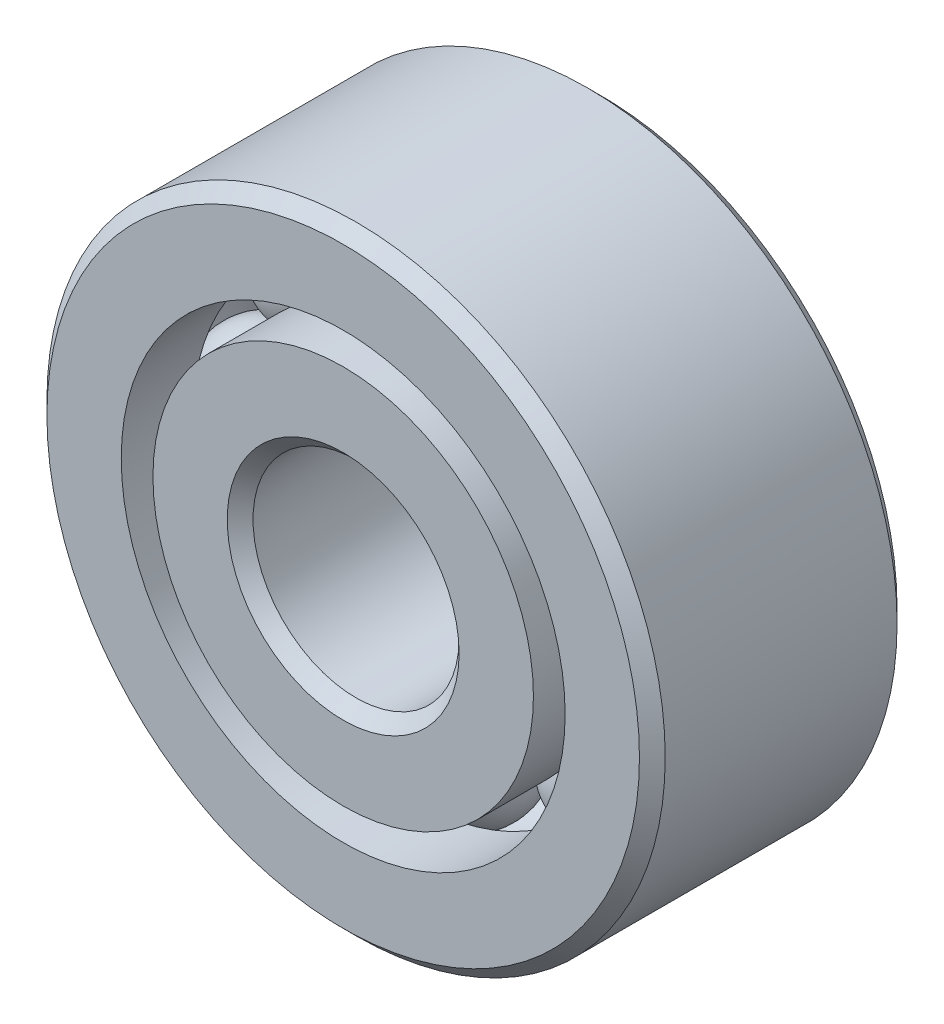
ISO-10303-21;
HEADER;
FILE_DESCRIPTION(('STEP AP214'),'2;1');
FILE_NAME('part.step','',(''),(''),'','','');
FILE_SCHEMA(('AUTOMOTIVE_DESIGN { 1 0 10303 214 1 1 1 1 }'));
ENDSEC;
DATA;
#1=APPLICATION_CONTEXT('core data for automotive mechanical design processes');
#2=APPLICATION_PROTOCOL_DEFINITION('international standard','automotive_design',2000,#1);
#3=PRODUCT_CONTEXT('',#1,'mechanical');
#4=PRODUCT('Part','Part','',(#3));
#5=PRODUCT_RELATED_PRODUCT_CATEGORY('part','',(#4));
#6=PRODUCT_DEFINITION_FORMATION('','',#4);
#7=PRODUCT_DEFINITION_CONTEXT('part definition',#1,'design');
#8=PRODUCT_DEFINITION('design','',#6,#7);
#9=PRODUCT_DEFINITION_SHAPE('','',#8);
#10=(LENGTH_UNIT() NAMED_UNIT(*) SI_UNIT(.MILLI.,.METRE.));
#11=(NAMED_UNIT(*) PLANE_ANGLE_UNIT() SI_UNIT($,.RADIAN.));
#12=(NAMED_UNIT(*) SI_UNIT($,.STERADIAN.) SOLID_ANGLE_UNIT());
#13=UNCERTAINTY_MEASURE_WITH_UNIT(LENGTH_MEASURE(1.E-05),#10,'distance_accuracy_value','');
#14=(GEOMETRIC_REPRESENTATION_CONTEXT(3) GLOBAL_UNCERTAINTY_ASSIGNED_CONTEXT((#13)) GLOBAL_UNIT_ASSIGNED_CONTEXT((#10,
#11,#12)) REPRESENTATION_CONTEXT('',''));
#15=CARTESIAN_POINT('',(0.,0.,0.));
#16=DIRECTION('',(0.,0.,1.));
#17=DIRECTION('',(1.,0.,0.));
#18=AXIS2_PLACEMENT_3D('',#15,#16,#17);
#19=CARTESIAN_POINT('',(-2.24506403026726,2.24506403026731,0.));
#20=DIRECTION('',(0.,0.,1.));
#21=DIRECTION('',(-0.707106781186539,0.707106781186556,0.));
#22=AXIS2_PLACEMENT_3D('',#19,#20,#21);
#23=SPHERICAL_SURFACE('',#22,0.915136422466877);
#24=CARTESIAN_POINT('',(-2.24506403026726,2.24506403026731,0.915136422466874));
#25=VERTEX_POINT('',#24);
#26=VERTEX_LOOP('',#25);
#27=FACE_BOUND('',#26,.T.);
#28=ADVANCED_FACE('F40',(#27),#23,.T.);
#29=CLOSED_SHELL('',(#28));
#30=MANIFOLD_SOLID_BREP('B2',#29);
#31=CARTESIAN_POINT('',(-3.175,0.,0.));
#32=DIRECTION('',(0.,0.,1.));
#33=DIRECTION('',(-1.,0.,0.));
#34=AXIS2_PLACEMENT_3D('',#31,#32,#33);
#35=SPHERICAL_SURFACE('',#34,0.915136422466877);
#36=CARTESIAN_POINT('',(-3.175,0.,0.915136422466874));
#37=VERTEX_POINT('',#36);
#38=VERTEX_LOOP('',#37);
#39=FACE_BOUND('',#38,.T.);
#40=ADVANCED_FACE('F61',(#39),#35,.T.);
#41=CLOSED_SHELL('',(#40));
#42=MANIFOLD_SOLID_BREP('B6',#41);
#43=CARTESIAN_POINT('',(-2.24506403026731,-2.24506403026727,0.));
#44=DIRECTION('',(0.,0.,1.));
#45=DIRECTION('',(-0.707106781186554,-0.707106781186541,0.));
#46=AXIS2_PLACEMENT_3D('',#43,#44,#45);
#47=SPHERICAL_SURFACE('',#46,0.915136422466877);
#48=CARTESIAN_POINT('',(-2.24506403026731,-2.24506403026727,0.915136422466874));
#49=VERTEX_POINT('',#48);
#50=VERTEX_LOOP('',#49);
#51=FACE_BOUND('',#50,.T.);
#52=ADVANCED_FACE('F82',(#51),#47,.T.);
#53=CLOSED_SHELL('',(#52));
#54=MANIFOLD_SOLID_BREP('B36',#53);
#55=CARTESIAN_POINT('',(0.,-3.175,0.));
#56=DIRECTION('',(0.,0.,1.));
#57=DIRECTION('',(0.,-1.,0.));
#58=AXIS2_PLACEMENT_3D('',#55,#56,#57);
#59=SPHERICAL_SURFACE('',#58,0.915136422466877);
#60=CARTESIAN_POINT('',(0.,-3.175,0.915136422466874));
#61=VERTEX_POINT('',#60);
#62=VERTEX_LOOP('',#61);
#63=FACE_BOUND('',#62,.T.);
#64=ADVANCED_FACE('F103',(#63),#59,.T.);
#65=CLOSED_SHELL('',(#64));
#66=MANIFOLD_SOLID_BREP('B57',#65);
#67=CARTESIAN_POINT('',(2.24506403026727,-2.2450640302673,0.));
#68=DIRECTION('',(0.,0.,1.));
#69=DIRECTION('',(0.707106781186544,-0.707106781186551,0.));
#70=AXIS2_PLACEMENT_3D('',#67,#68,#69);
#71=SPHERICAL_SURFACE('',#70,0.915136422466877);
#72=CARTESIAN_POINT('',(2.24506403026727,-2.2450640302673,0.915136422466874));
#73=VERTEX_POINT('',#72);
#74=VERTEX_LOOP('',#73);
#75=FACE_BOUND('',#74,.T.);
#76=ADVANCED_FACE('F124',(#75),#71,.T.);
#77=CLOSED_SHELL('',(#76));
#78=MANIFOLD_SOLID_BREP('B78',#77);
#79=CARTESIAN_POINT('',(3.175,0.,0.));
#80=DIRECTION('',(0.,0.,1.));
#81=DIRECTION('',(1.,0.,0.));
#82=AXIS2_PLACEMENT_3D('',#79,#80,#81);
#83=SPHERICAL_SURFACE('',#82,0.915136422466877);
#84=CARTESIAN_POINT('',(3.175,0.,0.915136422466874));
#85=VERTEX_POINT('',#84);
#86=VERTEX_LOOP('',#85);
#87=FACE_BOUND('',#86,.T.);
#88=ADVANCED_FACE('F145',(#87),#83,.T.);
#89=CLOSED_SHELL('',(#88));
#90=MANIFOLD_SOLID_BREP('B99',#89);
#91=CARTESIAN_POINT('',(2.24506403026729,2.24506403026728,0.));
#92=DIRECTION('',(0.,0.,1.));
#93=DIRECTION('',(0.707106781186549,0.707106781186546,0.));
#94=AXIS2_PLACEMENT_3D('',#91,#92,#93);
#95=SPHERICAL_SURFACE('',#94,0.915136422466877);
#96=CARTESIAN_POINT('',(2.24506403026729,2.24506403026728,0.915136422466874));
#97=VERTEX_POINT('',#96);
#98=VERTEX_LOOP('',#97);
#99=FACE_BOUND('',#98,.T.);
#100=ADVANCED_FACE('F166',(#99),#95,.T.);
#101=CLOSED_SHELL('',(#100));
#102=MANIFOLD_SOLID_BREP('B120',#101);
#103=CARTESIAN_POINT('',(0.,3.175,0.));
#104=DIRECTION('',(0.,0.,1.));
#105=DIRECTION('',(0.,1.,0.));
#106=AXIS2_PLACEMENT_3D('',#103,#104,#105);
#107=SPHERICAL_SURFACE('',#106,0.915136422466877);
#108=CARTESIAN_POINT('',(0.,3.175,0.915136422466874));
#109=VERTEX_POINT('',#108);
#110=VERTEX_LOOP('',#109);
#111=FACE_BOUND('',#110,.T.);
#112=ADVANCED_FACE('F189',(#111),#107,.T.);
#113=CLOSED_SHELL('',(#112));
#114=MANIFOLD_SOLID_BREP('B141',#113);
#115=CARTESIAN_POINT('',(0.,2.93076923076923,1.984375));
#116=DIRECTION('',(0.,0.,-1.));
#117=DIRECTION('',(-1.,0.,0.));
#118=AXIS2_PLACEMENT_3D('',#115,#116,#117);
#119=PLANE('',#118);
#120=CARTESIAN_POINT('',(0.,0.,1.984375));
#121=DIRECTION('',(0.,0.,1.));
#122=DIRECTION('',(1.,0.,0.));
#123=AXIS2_PLACEMENT_3D('',#120,#121,#122);
#124=CIRCLE('',#123,1.7859375);
#125=CARTESIAN_POINT('',(1.7859375,0.,1.984375));
#126=VERTEX_POINT('',#125);
#127=EDGE_CURVE('E237',#126,#126,#124,.T.);
#128=ORIENTED_EDGE('',*,*,#127,.F.);
#129=EDGE_LOOP('',(#128));
#130=FACE_BOUND('',#129,.T.);
#131=CARTESIAN_POINT('',(0.,0.,1.984375));
#132=DIRECTION('',(0.,0.,1.));
#133=DIRECTION('',(1.,0.,0.));
#134=AXIS2_PLACEMENT_3D('',#131,#132,#133);
#135=CIRCLE('',#134,2.93076923076923);
#136=CARTESIAN_POINT('',(2.93076923076923,0.,1.984375));
#137=VERTEX_POINT('',#136);
#138=EDGE_CURVE('E188',#137,#137,#135,.T.);
#139=ORIENTED_EDGE('',*,*,#138,.T.);
#140=EDGE_LOOP('',(#139));
#141=FACE_BOUND('',#140,.T.);
#142=ADVANCED_FACE('F209',(#130,#141),#119,.F.);
#143=CARTESIAN_POINT('',(0.,0.,1.984375));
#144=DIRECTION('',(0.,0.,1.));
#145=DIRECTION('',(1.,0.,0.));
#146=AXIS2_PLACEMENT_3D('',#143,#144,#145);
#147=CYLINDRICAL_SURFACE('',#146,2.93076923076923);
#148=ORIENTED_EDGE('',*,*,#138,.F.);
#149=EDGE_LOOP('',(#148));
#150=FACE_BOUND('',#149,.T.);
#151=CARTESIAN_POINT('',(0.,0.,0.881944444444442));
#152=DIRECTION('',(0.,0.,1.));
#153=DIRECTION('',(1.,0.,0.));
#154=AXIS2_PLACEMENT_3D('',#151,#152,#153);
#155=CIRCLE('',#154,2.93076923076923);
#156=CARTESIAN_POINT('',(2.93076923076923,0.,0.881944444444442));
#157=VERTEX_POINT('',#156);
#158=EDGE_CURVE('E215',#157,#157,#155,.T.);
#159=ORIENTED_EDGE('',*,*,#158,.T.);
#160=EDGE_LOOP('',(#159));
#161=FACE_BOUND('',#160,.T.);
#162=ADVANCED_FACE('F244',(#150,#161),#147,.T.);
#163=CARTESIAN_POINT('',(0.,0.,0.));
#164=DIRECTION('',(0.,0.,1.));
#165=DIRECTION('',(1.,0.,0.));
#166=AXIS2_PLACEMENT_3D('',#163,#164,#165);
#167=TOROIDAL_SURFACE('',#166,3.175,0.915136422466873);
#168=ORIENTED_EDGE('',*,*,#158,.F.);
#169=EDGE_LOOP('',(#168));
#170=FACE_BOUND('',#169,.T.);
#171=CARTESIAN_POINT('',(0.,0.,-0.881944444444445));
#172=DIRECTION('',(0.,0.,1.));
#173=DIRECTION('',(1.,0.,0.));
#174=AXIS2_PLACEMENT_3D('',#171,#172,#173);
#175=CIRCLE('',#174,2.93076923076923);
#176=CARTESIAN_POINT('',(2.93076923076923,0.,-0.881944444444445));
#177=VERTEX_POINT('',#176);
#178=EDGE_CURVE('E219',#177,#177,#175,.T.);
#179=ORIENTED_EDGE('',*,*,#178,.T.);
#180=EDGE_LOOP('',(#179));
#181=FACE_BOUND('',#180,.T.);
#182=ADVANCED_FACE('F248',(#170,#181),#167,.F.);
#183=CARTESIAN_POINT('',(0.,0.,1.984375));
#184=DIRECTION('',(0.,0.,1.));
#185=DIRECTION('',(1.,0.,0.));
#186=AXIS2_PLACEMENT_3D('',#183,#184,#185);
#187=CYLINDRICAL_SURFACE('',#186,2.93076923076923);
#188=ORIENTED_EDGE('',*,*,#178,.F.);
#189=EDGE_LOOP('',(#188));
#190=FACE_BOUND('',#189,.T.);
#191=CARTESIAN_POINT('',(0.,0.,-1.984375));
#192=DIRECTION('',(0.,0.,1.));
#193=DIRECTION('',(1.,0.,0.));
#194=AXIS2_PLACEMENT_3D('',#191,#192,#193);
#195=CIRCLE('',#194,2.93076923076923);
#196=CARTESIAN_POINT('',(2.93076923076923,0.,-1.984375));
#197=VERTEX_POINT('',#196);
#198=EDGE_CURVE('E223',#197,#197,#195,.T.);
#199=ORIENTED_EDGE('',*,*,#198,.T.);
#200=EDGE_LOOP('',(#199));
#201=FACE_BOUND('',#200,.T.);
#202=ADVANCED_FACE('F253',(#190,#201),#187,.T.);
#203=CARTESIAN_POINT('',(0.,1.7859375,-1.984375));
#204=DIRECTION('',(0.,0.,1.));
#205=DIRECTION('',(1.,0.,0.));
#206=AXIS2_PLACEMENT_3D('',#203,#204,#205);
#207=PLANE('',#206);
#208=ORIENTED_EDGE('',*,*,#198,.F.);
#209=EDGE_LOOP('',(#208));
#210=FACE_BOUND('',#209,.T.);
#211=CARTESIAN_POINT('',(0.,0.,-1.98437500000001));
#212=DIRECTION('',(0.,0.,1.));
#213=DIRECTION('',(1.,0.,0.));
#214=AXIS2_PLACEMENT_3D('',#211,#212,#213);
#215=CIRCLE('',#214,1.7859375);
#216=CARTESIAN_POINT('',(1.7859375,0.,-1.98437500000001));
#217=VERTEX_POINT('',#216);
#218=EDGE_CURVE('E228',#217,#217,#215,.T.);
#219=ORIENTED_EDGE('',*,*,#218,.T.);
#220=EDGE_LOOP('',(#219));
#221=FACE_BOUND('',#220,.T.);
#222=ADVANCED_FACE('F259',(#210,#221),#207,.F.);
#223=CARTESIAN_POINT('',(0.,0.,-1.78593750000001));
#224=DIRECTION('',(0.,0.,-1.));
#225=DIRECTION('',(-1.,0.,0.));
#226=AXIS2_PLACEMENT_3D('',#223,#224,#225);
#227=CONICAL_SURFACE('',#226,1.5875,0.785398163397446);
#228=ORIENTED_EDGE('',*,*,#218,.F.);
#229=EDGE_LOOP('',(#228));
#230=FACE_BOUND('',#229,.T.);
#231=CARTESIAN_POINT('',(0.,0.,-1.78593750000001));
#232=DIRECTION('',(0.,0.,1.));
#233=DIRECTION('',(1.,0.,0.));
#234=AXIS2_PLACEMENT_3D('',#231,#232,#233);
#235=CIRCLE('',#234,1.5875);
#236=CARTESIAN_POINT('',(1.5875,0.,-1.78593750000001));
#237=VERTEX_POINT('',#236);
#238=EDGE_CURVE('E231',#237,#237,#235,.T.);
#239=ORIENTED_EDGE('',*,*,#238,.T.);
#240=EDGE_LOOP('',(#239));
#241=FACE_BOUND('',#240,.T.);
#242=ADVANCED_FACE('F263',(#230,#241),#227,.F.);
#243=CARTESIAN_POINT('',(0.,0.,1.984375));
#244=DIRECTION('',(0.,0.,1.));
#245=DIRECTION('',(1.,0.,0.));
#246=AXIS2_PLACEMENT_3D('',#243,#244,#245);
#247=CYLINDRICAL_SURFACE('',#246,1.5875);
#248=ORIENTED_EDGE('',*,*,#238,.F.);
#249=EDGE_LOOP('',(#248));
#250=FACE_BOUND('',#249,.T.);
#251=CARTESIAN_POINT('',(0.,0.,1.7859375));
#252=DIRECTION('',(0.,0.,1.));
#253=DIRECTION('',(1.,0.,0.));
#254=AXIS2_PLACEMENT_3D('',#251,#252,#253);
#255=CIRCLE('',#254,1.5875);
#256=CARTESIAN_POINT('',(1.5875,0.,1.7859375));
#257=VERTEX_POINT('',#256);
#258=EDGE_CURVE('E234',#257,#257,#255,.T.);
#259=ORIENTED_EDGE('',*,*,#258,.T.);
#260=EDGE_LOOP('',(#259));
#261=FACE_BOUND('',#260,.T.);
#262=ADVANCED_FACE('F267',(#250,#261),#247,.F.);
#263=CARTESIAN_POINT('',(0.,0.,1.984375));
#264=DIRECTION('',(0.,0.,1.));
#265=DIRECTION('',(1.,0.,0.));
#266=AXIS2_PLACEMENT_3D('',#263,#264,#265);
#267=CONICAL_SURFACE('',#266,1.7859375,0.785398163397446);
#268=ORIENTED_EDGE('',*,*,#258,.F.);
#269=EDGE_LOOP('',(#268));
#270=FACE_BOUND('',#269,.T.);
#271=ORIENTED_EDGE('',*,*,#127,.T.);
#272=EDGE_LOOP('',(#271));
#273=FACE_BOUND('',#272,.T.);
#274=ADVANCED_FACE('F241',(#270,#273),#267,.F.);
#275=CLOSED_SHELL('',(#142,#162,#182,#202,#222,#242,#262,#274));
#276=MANIFOLD_SOLID_BREP('B162',#275);
#277=CARTESIAN_POINT('',(0.,0.,1.7859375));
#278=DIRECTION('',(0.,0.,-1.));
#279=DIRECTION('',(-1.,0.,0.));
#280=AXIS2_PLACEMENT_3D('',#277,#278,#279);
#281=CONICAL_SURFACE('',#280,4.7625,0.785398163397446);
#282=CARTESIAN_POINT('',(0.,0.,1.984375));
#283=DIRECTION('',(0.,0.,1.));
#284=DIRECTION('',(1.,0.,0.));
#285=AXIS2_PLACEMENT_3D('',#282,#283,#284);
#286=CIRCLE('',#285,4.5640625);
#287=CARTESIAN_POINT('',(4.5640625,0.,1.984375));
#288=VERTEX_POINT('',#287);
#289=EDGE_CURVE('E359',#288,#288,#286,.T.);
#290=ORIENTED_EDGE('',*,*,#289,.F.);
#291=EDGE_LOOP('',(#290));
#292=FACE_BOUND('',#291,.T.);
#293=CARTESIAN_POINT('',(0.,0.,1.7859375));
#294=DIRECTION('',(0.,0.,1.));
#295=DIRECTION('',(1.,0.,0.));
#296=AXIS2_PLACEMENT_3D('',#293,#294,#295);
#297=CIRCLE('',#296,4.7625);
#298=CARTESIAN_POINT('',(4.7625,0.,1.7859375));
#299=VERTEX_POINT('',#298);
#300=EDGE_CURVE('E208',#299,#299,#297,.T.);
#301=ORIENTED_EDGE('',*,*,#300,.T.);
#302=EDGE_LOOP('',(#301));
#303=FACE_BOUND('',#302,.T.);
#304=ADVANCED_FACE('F331',(#292,#303),#281,.T.);
#305=CARTESIAN_POINT('',(0.,0.,1.984375));
#306=DIRECTION('',(0.,0.,1.));
#307=DIRECTION('',(1.,0.,0.));
#308=AXIS2_PLACEMENT_3D('',#305,#306,#307);
#309=CYLINDRICAL_SURFACE('',#308,4.7625);
#310=ORIENTED_EDGE('',*,*,#300,.F.);
#311=EDGE_LOOP('',(#310));
#312=FACE_BOUND('',#311,.T.);
#313=CARTESIAN_POINT('',(0.,0.,-1.78593750000001));
#314=DIRECTION('',(0.,0.,1.));
#315=DIRECTION('',(1.,0.,0.));
#316=AXIS2_PLACEMENT_3D('',#313,#314,#315);
#317=CIRCLE('',#316,4.7625);
#318=CARTESIAN_POINT('',(4.7625,0.,-1.78593750000001));
#319=VERTEX_POINT('',#318);
#320=EDGE_CURVE('E337',#319,#319,#317,.T.);
#321=ORIENTED_EDGE('',*,*,#320,.T.);
#322=EDGE_LOOP('',(#321));
#323=FACE_BOUND('',#322,.T.);
#324=ADVANCED_FACE('F366',(#312,#323),#309,.T.);
#325=CARTESIAN_POINT('',(0.,0.,-1.98437500000001));
#326=DIRECTION('',(0.,0.,1.));
#327=DIRECTION('',(1.,0.,0.));
#328=AXIS2_PLACEMENT_3D('',#325,#326,#327);
#329=CONICAL_SURFACE('',#328,4.5640625,0.785398163397446);
#330=ORIENTED_EDGE('',*,*,#320,.F.);
#331=EDGE_LOOP('',(#330));
#332=FACE_BOUND('',#331,.T.);
#333=CARTESIAN_POINT('',(0.,0.,-1.98437500000001));
#334=DIRECTION('',(0.,0.,1.));
#335=DIRECTION('',(1.,0.,0.));
#336=AXIS2_PLACEMENT_3D('',#333,#334,#335);
#337=CIRCLE('',#336,4.5640625);
#338=CARTESIAN_POINT('',(4.5640625,0.,-1.98437500000001));
#339=VERTEX_POINT('',#338);
#340=EDGE_CURVE('E341',#339,#339,#337,.T.);
#341=ORIENTED_EDGE('',*,*,#340,.T.);
#342=EDGE_LOOP('',(#341));
#343=FACE_BOUND('',#342,.T.);
#344=ADVANCED_FACE('F370',(#332,#343),#329,.T.);
#345=CARTESIAN_POINT('',(0.,4.5640625,-1.98437500000001));
#346=DIRECTION('',(0.,0.,1.));
#347=DIRECTION('',(1.,0.,0.));
#348=AXIS2_PLACEMENT_3D('',#345,#346,#347);
#349=PLANE('',#348);
#350=ORIENTED_EDGE('',*,*,#340,.F.);
#351=EDGE_LOOP('',(#350));
#352=FACE_BOUND('',#351,.T.);
#353=CARTESIAN_POINT('',(0.,0.,-1.98437500000001));
#354=DIRECTION('',(0.,0.,1.));
#355=DIRECTION('',(1.,0.,0.));
#356=AXIS2_PLACEMENT_3D('',#353,#354,#355);
#357=CIRCLE('',#356,3.41923076923077);
#358=CARTESIAN_POINT('',(3.41923076923077,0.,-1.98437500000001));
#359=VERTEX_POINT('',#358);
#360=EDGE_CURVE('E345',#359,#359,#357,.T.);
#361=ORIENTED_EDGE('',*,*,#360,.T.);
#362=EDGE_LOOP('',(#361));
#363=FACE_BOUND('',#362,.T.);
#364=ADVANCED_FACE('F375',(#352,#363),#349,.F.);
#365=CARTESIAN_POINT('',(0.,0.,1.984375));
#366=DIRECTION('',(0.,0.,1.));
#367=DIRECTION('',(1.,0.,0.));
#368=AXIS2_PLACEMENT_3D('',#365,#366,#367);
#369=CYLINDRICAL_SURFACE('',#368,3.41923076923077);
#370=ORIENTED_EDGE('',*,*,#360,.F.);
#371=EDGE_LOOP('',(#370));
#372=FACE_BOUND('',#371,.T.);
#373=CARTESIAN_POINT('',(0.,0.,-0.881944444444447));
#374=DIRECTION('',(0.,0.,1.));
#375=DIRECTION('',(1.,0.,0.));
#376=AXIS2_PLACEMENT_3D('',#373,#374,#375);
#377=CIRCLE('',#376,3.41923076923077);
#378=CARTESIAN_POINT('',(3.41923076923077,0.,-0.881944444444447));
#379=VERTEX_POINT('',#378);
#380=EDGE_CURVE('E350',#379,#379,#377,.T.);
#381=ORIENTED_EDGE('',*,*,#380,.T.);
#382=EDGE_LOOP('',(#381));
#383=FACE_BOUND('',#382,.T.);
#384=ADVANCED_FACE('F381',(#372,#383),#369,.F.);
#385=CARTESIAN_POINT('',(0.,0.,0.));
#386=DIRECTION('',(0.,0.,1.));
#387=DIRECTION('',(1.,0.,0.));
#388=AXIS2_PLACEMENT_3D('',#385,#386,#387);
#389=TOROIDAL_SURFACE('',#388,3.175,0.915136422466877);
#390=ORIENTED_EDGE('',*,*,#380,.F.);
#391=EDGE_LOOP('',(#390));
#392=FACE_BOUND('',#391,.T.);
#393=CARTESIAN_POINT('',(0.,0.,0.881944444444442));
#394=DIRECTION('',(0.,0.,1.));
#395=DIRECTION('',(1.,0.,0.));
#396=AXIS2_PLACEMENT_3D('',#393,#394,#395);
#397=CIRCLE('',#396,3.41923076923077);
#398=CARTESIAN_POINT('',(3.41923076923077,0.,0.881944444444442));
#399=VERTEX_POINT('',#398);
#400=EDGE_CURVE('E353',#399,#399,#397,.T.);
#401=ORIENTED_EDGE('',*,*,#400,.T.);
#402=EDGE_LOOP('',(#401));
#403=FACE_BOUND('',#402,.T.);
#404=ADVANCED_FACE('F385',(#392,#403),#389,.F.);
#405=CARTESIAN_POINT('',(0.,0.,1.984375));
#406=DIRECTION('',(0.,0.,1.));
#407=DIRECTION('',(1.,0.,0.));
#408=AXIS2_PLACEMENT_3D('',#405,#406,#407);
#409=CYLINDRICAL_SURFACE('',#408,3.41923076923077);
#410=ORIENTED_EDGE('',*,*,#400,.F.);
#411=EDGE_LOOP('',(#410));
#412=FACE_BOUND('',#411,.T.);
#413=CARTESIAN_POINT('',(0.,0.,1.984375));
#414=DIRECTION('',(0.,0.,1.));
#415=DIRECTION('',(1.,0.,0.));
#416=AXIS2_PLACEMENT_3D('',#413,#414,#415);
#417=CIRCLE('',#416,3.41923076923077);
#418=CARTESIAN_POINT('',(3.41923076923077,0.,1.984375));
#419=VERTEX_POINT('',#418);
#420=EDGE_CURVE('E356',#419,#419,#417,.T.);
#421=ORIENTED_EDGE('',*,*,#420,.T.);
#422=EDGE_LOOP('',(#421));
#423=FACE_BOUND('',#422,.T.);
#424=ADVANCED_FACE('F389',(#412,#423),#409,.F.);
#425=CARTESIAN_POINT('',(0.,4.5640625,1.984375));
#426=DIRECTION('',(0.,0.,-1.));
#427=DIRECTION('',(-1.,0.,0.));
#428=AXIS2_PLACEMENT_3D('',#425,#426,#427);
#429=PLANE('',#428);
#430=ORIENTED_EDGE('',*,*,#420,.F.);
#431=EDGE_LOOP('',(#430));
#432=FACE_BOUND('',#431,.T.);
#433=ORIENTED_EDGE('',*,*,#289,.T.);
#434=EDGE_LOOP('',(#433));
#435=FACE_BOUND('',#434,.T.);
#436=ADVANCED_FACE('F363',(#432,#435),#429,.F.);
#437=CLOSED_SHELL('',(#304,#324,#344,#364,#384,#404,#424,#436));
#438=MANIFOLD_SOLID_BREP('B183',#437);
#439=ADVANCED_BREP_SHAPE_REPRESENTATION('',(#18,#30,#42,#54,#66,#78,#90,#102,#114,#276,#438),#14);
#440=SHAPE_DEFINITION_REPRESENTATION(#9,#439);
ENDSEC;
END-ISO-10303-21;
